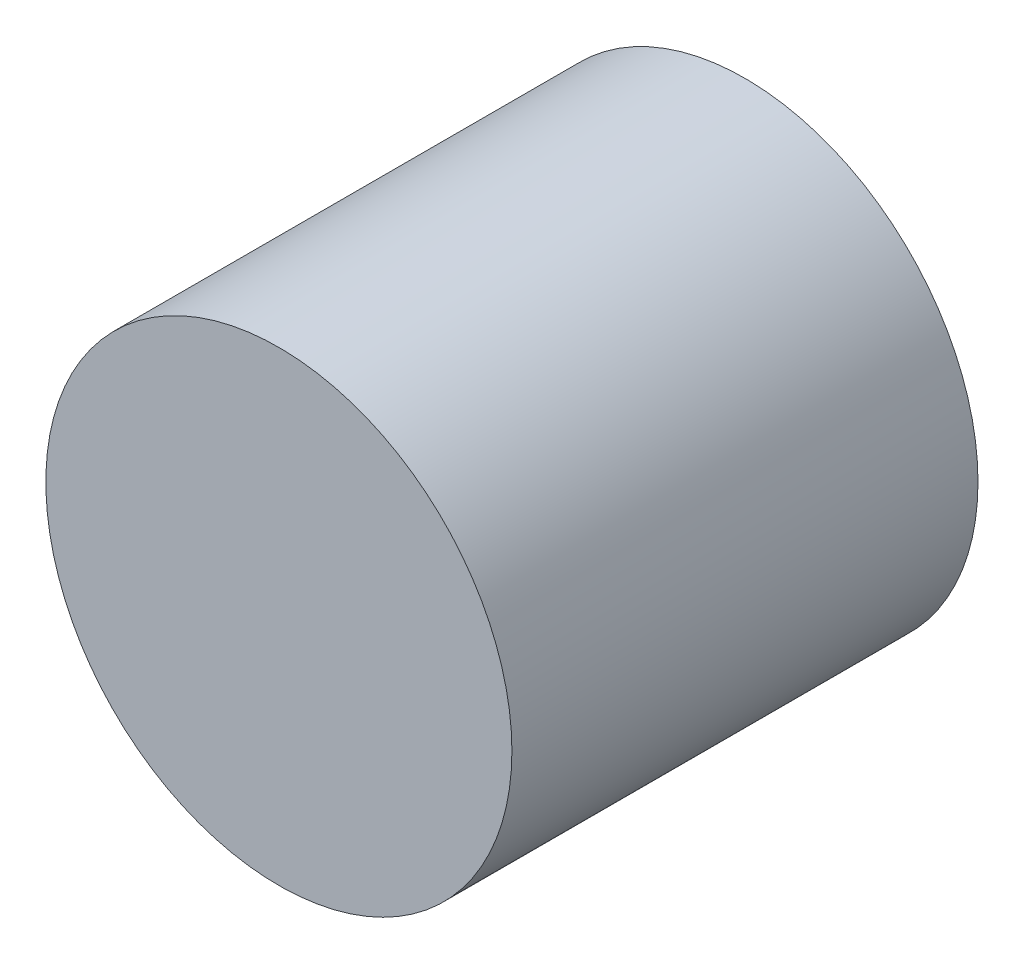
ISO-10303-21;
HEADER;
FILE_DESCRIPTION(('STEP AP214'),'2;1');
FILE_NAME('part.step','',(''),(''),'','','');
FILE_SCHEMA(('AUTOMOTIVE_DESIGN { 1 0 10303 214 1 1 1 1 }'));
ENDSEC;
DATA;
#1=APPLICATION_CONTEXT('core data for automotive mechanical design processes');
#2=APPLICATION_PROTOCOL_DEFINITION('international standard','automotive_design',2000,#1);
#3=PRODUCT_CONTEXT('',#1,'mechanical');
#4=PRODUCT('Part','Part','',(#3));
#5=PRODUCT_RELATED_PRODUCT_CATEGORY('part','',(#4));
#6=PRODUCT_DEFINITION_FORMATION('','',#4);
#7=PRODUCT_DEFINITION_CONTEXT('part definition',#1,'design');
#8=PRODUCT_DEFINITION('design','',#6,#7);
#9=PRODUCT_DEFINITION_SHAPE('','',#8);
#10=(LENGTH_UNIT() NAMED_UNIT(*) SI_UNIT(.MILLI.,.METRE.));
#11=(NAMED_UNIT(*) PLANE_ANGLE_UNIT() SI_UNIT($,.RADIAN.));
#12=(NAMED_UNIT(*) SI_UNIT($,.STERADIAN.) SOLID_ANGLE_UNIT());
#13=UNCERTAINTY_MEASURE_WITH_UNIT(LENGTH_MEASURE(1.E-05),#10,'distance_accuracy_value','');
#14=(GEOMETRIC_REPRESENTATION_CONTEXT(3) GLOBAL_UNCERTAINTY_ASSIGNED_CONTEXT((#13)) GLOBAL_UNIT_ASSIGNED_CONTEXT((#10,
#11,#12)) REPRESENTATION_CONTEXT('',''));
#15=CARTESIAN_POINT('',(0.,0.,0.));
#16=DIRECTION('',(0.,0.,1.));
#17=DIRECTION('',(1.,0.,0.));
#18=AXIS2_PLACEMENT_3D('',#15,#16,#17);
#19=CARTESIAN_POINT('',(0.,0.,6.35));
#20=DIRECTION('',(0.,0.,-1.));
#21=DIRECTION('',(-1.,0.,0.));
#22=AXIS2_PLACEMENT_3D('',#19,#20,#21);
#23=CYLINDRICAL_SURFACE('',#22,3.175);
#24=CARTESIAN_POINT('',(0.,0.,6.35));
#25=DIRECTION('',(0.,0.,1.));
#26=DIRECTION('',(1.,0.,0.));
#27=AXIS2_PLACEMENT_3D('',#24,#25,#26);
#28=CIRCLE('',#27,3.175);
#29=CARTESIAN_POINT('',(3.175,0.,6.35));
#30=VERTEX_POINT('',#29);
#31=EDGE_CURVE('E10',#30,#30,#28,.T.);
#32=ORIENTED_EDGE('',*,*,#31,.F.);
#33=EDGE_LOOP('',(#32));
#34=FACE_BOUND('',#33,.T.);
#35=CARTESIAN_POINT('',(0.,0.,0.));
#36=DIRECTION('',(0.,0.,1.));
#37=DIRECTION('',(1.,0.,0.));
#38=AXIS2_PLACEMENT_3D('',#35,#36,#37);
#39=CIRCLE('',#38,3.175);
#40=CARTESIAN_POINT('',(3.175,0.,0.));
#41=VERTEX_POINT('',#40);
#42=EDGE_CURVE('E32',#41,#41,#39,.T.);
#43=ORIENTED_EDGE('',*,*,#42,.T.);
#44=EDGE_LOOP('',(#43));
#45=FACE_BOUND('',#44,.T.);
#46=ADVANCED_FACE('F29',(#34,#45),#23,.T.);
#47=CARTESIAN_POINT('',(0.,0.,6.35));
#48=DIRECTION('',(0.,0.,1.));
#49=DIRECTION('',(1.,0.,0.));
#50=AXIS2_PLACEMENT_3D('',#47,#48,#49);
#51=PLANE('',#50);
#52=ORIENTED_EDGE('',*,*,#31,.T.);
#53=EDGE_LOOP('',(#52));
#54=FACE_BOUND('',#53,.T.);
#55=ADVANCED_FACE('F44',(#54),#51,.T.);
#56=CARTESIAN_POINT('',(0.,0.,0.));
#57=DIRECTION('',(0.,0.,1.));
#58=DIRECTION('',(1.,0.,0.));
#59=AXIS2_PLACEMENT_3D('',#56,#57,#58);
#60=PLANE('',#59);
#61=ORIENTED_EDGE('',*,*,#42,.F.);
#62=EDGE_LOOP('',(#61));
#63=FACE_BOUND('',#62,.T.);
#64=ADVANCED_FACE('F42',(#63),#60,.F.);
#65=CLOSED_SHELL('',(#46,#55,#64));
#66=MANIFOLD_SOLID_BREP('B2',#65);
#67=ADVANCED_BREP_SHAPE_REPRESENTATION('',(#18,#66),#14);
#68=SHAPE_DEFINITION_REPRESENTATION(#9,#67);
ENDSEC;
END-ISO-10303-21;
